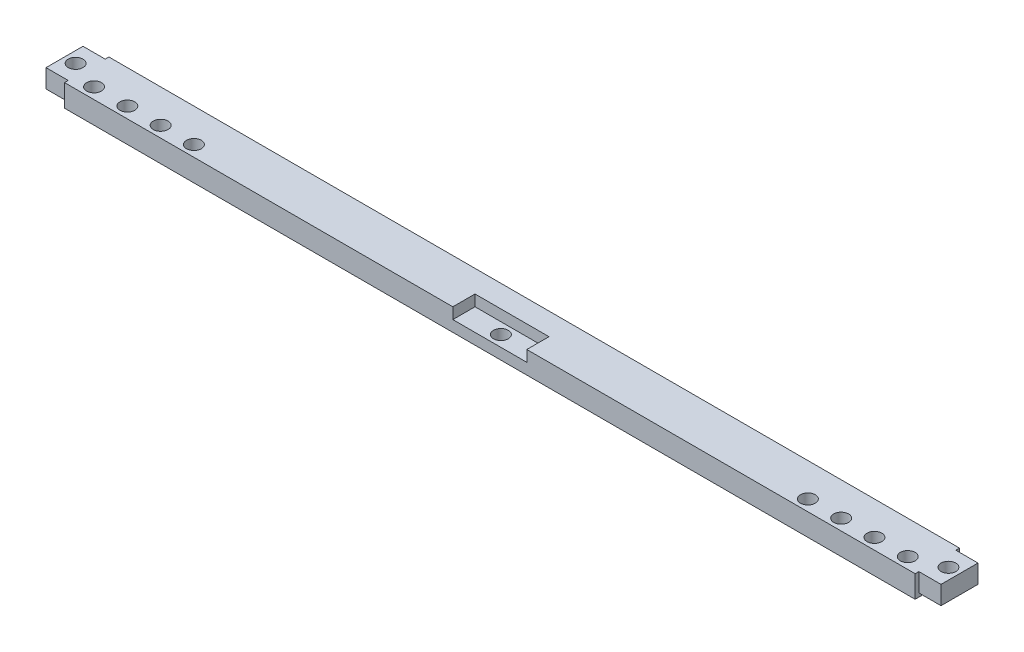
ISO-10303-21;
HEADER;
FILE_DESCRIPTION(('STEP AP214'),'2;1');
FILE_NAME('part.step','',(''),(''),'','','');
FILE_SCHEMA(('AUTOMOTIVE_DESIGN { 1 0 10303 214 1 1 1 1 }'));
ENDSEC;
DATA;
#1=APPLICATION_CONTEXT('core data for automotive mechanical design processes');
#2=APPLICATION_PROTOCOL_DEFINITION('international standard','automotive_design',2000,#1);
#3=PRODUCT_CONTEXT('',#1,'mechanical');
#4=PRODUCT('Part','Part','',(#3));
#5=PRODUCT_RELATED_PRODUCT_CATEGORY('part','',(#4));
#6=PRODUCT_DEFINITION_FORMATION('','',#4);
#7=PRODUCT_DEFINITION_CONTEXT('part definition',#1,'design');
#8=PRODUCT_DEFINITION('design','',#6,#7);
#9=PRODUCT_DEFINITION_SHAPE('','',#8);
#10=(LENGTH_UNIT() NAMED_UNIT(*) SI_UNIT(.MILLI.,.METRE.));
#11=(NAMED_UNIT(*) PLANE_ANGLE_UNIT() SI_UNIT($,.RADIAN.));
#12=(NAMED_UNIT(*) SI_UNIT($,.STERADIAN.) SOLID_ANGLE_UNIT());
#13=UNCERTAINTY_MEASURE_WITH_UNIT(LENGTH_MEASURE(1.E-05),#10,'distance_accuracy_value','');
#14=(GEOMETRIC_REPRESENTATION_CONTEXT(3) GLOBAL_UNCERTAINTY_ASSIGNED_CONTEXT((#13)) GLOBAL_UNIT_ASSIGNED_CONTEXT((#10,
#11,#12)) REPRESENTATION_CONTEXT('',''));
#15=CARTESIAN_POINT('',(0.,0.,0.));
#16=DIRECTION('',(0.,0.,1.));
#17=DIRECTION('',(1.,0.,0.));
#18=AXIS2_PLACEMENT_3D('',#15,#16,#17);
#19=CARTESIAN_POINT('',(307.34,15.24,15.24));
#20=DIRECTION('',(-1.,0.,0.));
#21=DIRECTION('',(0.,0.,1.));
#22=AXIS2_PLACEMENT_3D('',#19,#20,#21);
#23=PLANE('',#22);
#24=DIRECTION('',(0.,0.,1.));
#25=VECTOR('',#24,1.);
#26=CARTESIAN_POINT('',(307.34,2.54,-12.7));
#27=LINE('',#26,#25);
#28=CARTESIAN_POINT('',(307.34,2.54,-12.7));
#29=VERTEX_POINT('',#28);
#30=CARTESIAN_POINT('',(307.34,2.54,12.7));
#31=VERTEX_POINT('',#30);
#32=EDGE_CURVE('E211',#29,#31,#27,.T.);
#33=ORIENTED_EDGE('',*,*,#32,.F.);
#34=DIRECTION('',(0.,1.,0.));
#35=VECTOR('',#34,1.);
#36=CARTESIAN_POINT('',(307.34,0.,-12.7));
#37=LINE('',#36,#35);
#38=CARTESIAN_POINT('',(307.34,15.24,-12.7));
#39=VERTEX_POINT('',#38);
#40=EDGE_CURVE('E228',#29,#39,#37,.T.);
#41=ORIENTED_EDGE('',*,*,#40,.T.);
#42=DIRECTION('',(0.,0.,-1.));
#43=VECTOR('',#42,1.);
#44=CARTESIAN_POINT('',(307.34,15.24,15.24));
#45=LINE('',#44,#43);
#46=CARTESIAN_POINT('',(307.34,15.24,12.7));
#47=VERTEX_POINT('',#46);
#48=EDGE_CURVE('E111',#47,#39,#45,.T.);
#49=ORIENTED_EDGE('',*,*,#48,.F.);
#50=DIRECTION('',(0.,1.,0.));
#51=VECTOR('',#50,1.);
#52=CARTESIAN_POINT('',(307.34,0.,12.7));
#53=LINE('',#52,#51);
#54=EDGE_CURVE('E262',#31,#47,#53,.T.);
#55=ORIENTED_EDGE('',*,*,#54,.F.);
#56=EDGE_LOOP('',(#33,#41,#49,#55));
#57=FACE_BOUND('',#56,.T.);
#58=ADVANCED_FACE('F33',(#57),#23,.F.);
#59=CARTESIAN_POINT('',(307.34,0.,12.7));
#60=DIRECTION('',(0.,0.,-1.));
#61=DIRECTION('',(-1.,0.,0.));
#62=AXIS2_PLACEMENT_3D('',#59,#60,#61);
#63=PLANE('',#62);
#64=DIRECTION('',(-1.,0.,0.));
#65=VECTOR('',#64,1.);
#66=CARTESIAN_POINT('',(307.34,2.54,12.7));
#67=LINE('',#66,#65);
#68=CARTESIAN_POINT('',(292.1,2.54,12.7));
#69=VERTEX_POINT('',#68);
#70=EDGE_CURVE('E214',#31,#69,#67,.T.);
#71=ORIENTED_EDGE('',*,*,#70,.F.);
#72=ORIENTED_EDGE('',*,*,#54,.T.);
#73=DIRECTION('',(-1.,0.,0.));
#74=VECTOR('',#73,1.);
#75=CARTESIAN_POINT('',(307.34,15.24,12.7));
#76=LINE('',#75,#74);
#77=CARTESIAN_POINT('',(292.1,15.24,12.7));
#78=VERTEX_POINT('',#77);
#79=EDGE_CURVE('E223',#47,#78,#76,.T.);
#80=ORIENTED_EDGE('',*,*,#79,.T.);
#81=DIRECTION('',(0.,1.,0.));
#82=VECTOR('',#81,1.);
#83=CARTESIAN_POINT('',(292.1,0.,12.7));
#84=LINE('',#83,#82);
#85=EDGE_CURVE('E265',#69,#78,#84,.T.);
#86=ORIENTED_EDGE('',*,*,#85,.F.);
#87=EDGE_LOOP('',(#71,#72,#80,#86));
#88=FACE_BOUND('',#87,.T.);
#89=ADVANCED_FACE('F274',(#88),#63,.F.);
#90=CARTESIAN_POINT('',(307.34,0.,-12.7));
#91=DIRECTION('',(0.,0.,1.));
#92=DIRECTION('',(1.,0.,0.));
#93=AXIS2_PLACEMENT_3D('',#90,#91,#92);
#94=PLANE('',#93);
#95=DIRECTION('',(1.,0.,0.));
#96=VECTOR('',#95,1.);
#97=CARTESIAN_POINT('',(307.34,2.54,-12.7));
#98=LINE('',#97,#96);
#99=CARTESIAN_POINT('',(292.1,2.54,-12.7));
#100=VERTEX_POINT('',#99);
#101=EDGE_CURVE('E220',#100,#29,#98,.T.);
#102=ORIENTED_EDGE('',*,*,#101,.F.);
#103=DIRECTION('',(0.,1.,0.));
#104=VECTOR('',#103,1.);
#105=CARTESIAN_POINT('',(292.1,0.,-12.7));
#106=LINE('',#105,#104);
#107=CARTESIAN_POINT('',(292.1,15.24,-12.7));
#108=VERTEX_POINT('',#107);
#109=EDGE_CURVE('E252',#100,#108,#106,.T.);
#110=ORIENTED_EDGE('',*,*,#109,.T.);
#111=DIRECTION('',(1.,0.,0.));
#112=VECTOR('',#111,1.);
#113=CARTESIAN_POINT('',(307.34,15.24,-12.7));
#114=LINE('',#113,#112);
#115=EDGE_CURVE('E243',#108,#39,#114,.T.);
#116=ORIENTED_EDGE('',*,*,#115,.T.);
#117=ORIENTED_EDGE('',*,*,#40,.F.);
#118=EDGE_LOOP('',(#102,#110,#116,#117));
#119=FACE_BOUND('',#118,.T.);
#120=ADVANCED_FACE('F293',(#119),#94,.F.);
#121=CARTESIAN_POINT('',(-307.34,15.24,-15.24));
#122=DIRECTION('',(0.,0.,1.));
#123=DIRECTION('',(1.,0.,0.));
#124=AXIS2_PLACEMENT_3D('',#121,#122,#123);
#125=PLANE('',#124);
#126=DIRECTION('',(-1.,0.,0.));
#127=VECTOR('',#126,1.);
#128=CARTESIAN_POINT('',(-307.34,15.24,-15.24));
#129=LINE('',#128,#127);
#130=CARTESIAN_POINT('',(292.1,15.24,-15.24));
#131=VERTEX_POINT('',#130);
#132=CARTESIAN_POINT('',(-292.1,15.24,-15.24));
#133=VERTEX_POINT('',#132);
#134=EDGE_CURVE('E103',#131,#133,#129,.T.);
#135=ORIENTED_EDGE('',*,*,#134,.F.);
#136=DIRECTION('',(0.,1.,0.));
#137=VECTOR('',#136,1.);
#138=CARTESIAN_POINT('',(292.1,0.,-15.24));
#139=LINE('',#138,#137);
#140=CARTESIAN_POINT('',(292.1,0.,-15.24));
#141=VERTEX_POINT('',#140);
#142=EDGE_CURVE('E242',#141,#131,#139,.T.);
#143=ORIENTED_EDGE('',*,*,#142,.F.);
#144=DIRECTION('',(-1.,0.,0.));
#145=VECTOR('',#144,1.);
#146=CARTESIAN_POINT('',(-307.34,0.,-15.24));
#147=LINE('',#146,#145);
#148=CARTESIAN_POINT('',(-292.1,0.,-15.24));
#149=VERTEX_POINT('',#148);
#150=EDGE_CURVE('E58',#141,#149,#147,.T.);
#151=ORIENTED_EDGE('',*,*,#150,.T.);
#152=DIRECTION('',(0.,1.,0.));
#153=VECTOR('',#152,1.);
#154=CARTESIAN_POINT('',(-292.1,0.,-15.24));
#155=LINE('',#154,#153);
#156=EDGE_CURVE('E87',#149,#133,#155,.T.);
#157=ORIENTED_EDGE('',*,*,#156,.T.);
#158=EDGE_LOOP('',(#135,#143,#151,#157));
#159=FACE_BOUND('',#158,.T.);
#160=ADVANCED_FACE('F326',(#159),#125,.F.);
#161=CARTESIAN_POINT('',(-307.34,15.24,15.24));
#162=DIRECTION('',(1.,0.,0.));
#163=DIRECTION('',(0.,0.,-1.));
#164=AXIS2_PLACEMENT_3D('',#161,#162,#163);
#165=PLANE('',#164);
#166=DIRECTION('',(0.,1.,0.));
#167=VECTOR('',#166,1.);
#168=CARTESIAN_POINT('',(-307.34,0.,-12.7));
#169=LINE('',#168,#167);
#170=CARTESIAN_POINT('',(-307.34,2.54,-12.7));
#171=VERTEX_POINT('',#170);
#172=CARTESIAN_POINT('',(-307.34,15.24,-12.7));
#173=VERTEX_POINT('',#172);
#174=EDGE_CURVE('E88',#171,#173,#169,.T.);
#175=ORIENTED_EDGE('',*,*,#174,.F.);
#176=DIRECTION('',(0.,0.,-1.));
#177=VECTOR('',#176,1.);
#178=CARTESIAN_POINT('',(-307.34,2.54,-12.7));
#179=LINE('',#178,#177);
#180=CARTESIAN_POINT('',(-307.34,2.54,12.7));
#181=VERTEX_POINT('',#180);
#182=EDGE_CURVE('E124',#181,#171,#179,.T.);
#183=ORIENTED_EDGE('',*,*,#182,.F.);
#184=DIRECTION('',(0.,1.,0.));
#185=VECTOR('',#184,1.);
#186=CARTESIAN_POINT('',(-307.34,0.,12.7));
#187=LINE('',#186,#185);
#188=CARTESIAN_POINT('',(-307.34,15.24,12.7));
#189=VERTEX_POINT('',#188);
#190=EDGE_CURVE('E97',#181,#189,#187,.T.);
#191=ORIENTED_EDGE('',*,*,#190,.T.);
#192=DIRECTION('',(0.,0.,1.));
#193=VECTOR('',#192,1.);
#194=CARTESIAN_POINT('',(-307.34,15.24,15.24));
#195=LINE('',#194,#193);
#196=EDGE_CURVE('E116',#173,#189,#195,.T.);
#197=ORIENTED_EDGE('',*,*,#196,.F.);
#198=EDGE_LOOP('',(#175,#183,#191,#197));
#199=FACE_BOUND('',#198,.T.);
#200=ADVANCED_FACE('F328',(#199),#165,.F.);
#201=CARTESIAN_POINT('',(-307.34,15.24,15.24));
#202=DIRECTION('',(0.,0.,-1.));
#203=DIRECTION('',(-1.,0.,0.));
#204=AXIS2_PLACEMENT_3D('',#201,#202,#203);
#205=PLANE('',#204);
#206=DIRECTION('',(1.,0.,0.));
#207=VECTOR('',#206,1.);
#208=CARTESIAN_POINT('',(-307.34,15.24,15.24));
#209=LINE('',#208,#207);
#210=CARTESIAN_POINT('',(25.4,15.24,15.24));
#211=VERTEX_POINT('',#210);
#212=CARTESIAN_POINT('',(292.1,15.24,15.24));
#213=VERTEX_POINT('',#212);
#214=EDGE_CURVE('E41',#211,#213,#209,.T.);
#215=ORIENTED_EDGE('',*,*,#214,.F.);
#216=DIRECTION('',(0.,1.,0.));
#217=VECTOR('',#216,1.);
#218=CARTESIAN_POINT('',(25.4,7.62,15.24));
#219=LINE('',#218,#217);
#220=CARTESIAN_POINT('',(25.4,7.62,15.24));
#221=VERTEX_POINT('',#220);
#222=EDGE_CURVE('E190',#221,#211,#219,.T.);
#223=ORIENTED_EDGE('',*,*,#222,.F.);
#224=DIRECTION('',(1.,0.,0.));
#225=VECTOR('',#224,1.);
#226=CARTESIAN_POINT('',(-25.4,7.62,15.24));
#227=LINE('',#226,#225);
#228=CARTESIAN_POINT('',(-25.4,7.62,15.24));
#229=VERTEX_POINT('',#228);
#230=EDGE_CURVE('E180',#229,#221,#227,.T.);
#231=ORIENTED_EDGE('',*,*,#230,.F.);
#232=DIRECTION('',(0.,1.,0.));
#233=VECTOR('',#232,1.);
#234=CARTESIAN_POINT('',(-25.4,7.62,15.24));
#235=LINE('',#234,#233);
#236=CARTESIAN_POINT('',(-25.4,15.24,15.24));
#237=VERTEX_POINT('',#236);
#238=EDGE_CURVE('E192',#229,#237,#235,.T.);
#239=ORIENTED_EDGE('',*,*,#238,.T.);
#240=CARTESIAN_POINT('',(-292.1,15.24,15.24));
#241=VERTEX_POINT('',#240);
#242=EDGE_CURVE('E11',#241,#237,#209,.T.);
#243=ORIENTED_EDGE('',*,*,#242,.F.);
#244=DIRECTION('',(0.,1.,0.));
#245=VECTOR('',#244,1.);
#246=CARTESIAN_POINT('',(-292.1,0.,15.24));
#247=LINE('',#246,#245);
#248=CARTESIAN_POINT('',(-292.1,0.,15.24));
#249=VERTEX_POINT('',#248);
#250=EDGE_CURVE('E231',#249,#241,#247,.T.);
#251=ORIENTED_EDGE('',*,*,#250,.F.);
#252=DIRECTION('',(1.,0.,0.));
#253=VECTOR('',#252,1.);
#254=CARTESIAN_POINT('',(-307.34,0.,15.24));
#255=LINE('',#254,#253);
#256=CARTESIAN_POINT('',(292.1,0.,15.24));
#257=VERTEX_POINT('',#256);
#258=EDGE_CURVE('E114',#249,#257,#255,.T.);
#259=ORIENTED_EDGE('',*,*,#258,.T.);
#260=DIRECTION('',(0.,1.,0.));
#261=VECTOR('',#260,1.);
#262=CARTESIAN_POINT('',(292.1,0.,15.24));
#263=LINE('',#262,#261);
#264=EDGE_CURVE('E247',#257,#213,#263,.T.);
#265=ORIENTED_EDGE('',*,*,#264,.T.);
#266=EDGE_LOOP('',(#215,#223,#231,#239,#243,#251,#259,#265));
#267=FACE_BOUND('',#266,.T.);
#268=ADVANCED_FACE('F310',(#267),#205,.F.);
#269=CARTESIAN_POINT('',(0.,15.24,0.));
#270=DIRECTION('',(0.,-1.,0.));
#271=DIRECTION('',(0.,0.,-1.));
#272=AXIS2_PLACEMENT_3D('',#269,#270,#271);
#273=PLANE('',#272);
#274=CARTESIAN_POINT('',(-256.54,15.24,7.62));
#275=DIRECTION('',(0.,1.,0.));
#276=DIRECTION('',(0.,0.,1.));
#277=AXIS2_PLACEMENT_3D('',#274,#275,#276);
#278=CIRCLE('',#277,5.07999999999996);
#279=CARTESIAN_POINT('',(-256.54,15.24,12.7));
#280=VERTEX_POINT('',#279);
#281=EDGE_CURVE('E139',#280,#280,#278,.T.);
#282=ORIENTED_EDGE('',*,*,#281,.F.);
#283=EDGE_LOOP('',(#282));
#284=FACE_BOUND('',#283,.T.);
#285=CARTESIAN_POINT('',(-233.68,15.24,7.62));
#286=DIRECTION('',(0.,1.,0.));
#287=DIRECTION('',(0.,0.,1.));
#288=AXIS2_PLACEMENT_3D('',#285,#286,#287);
#289=CIRCLE('',#288,5.07999999999999);
#290=CARTESIAN_POINT('',(-233.68,15.24,12.7));
#291=VERTEX_POINT('',#290);
#292=EDGE_CURVE('E609',#291,#291,#289,.T.);
#293=ORIENTED_EDGE('',*,*,#292,.F.);
#294=EDGE_LOOP('',(#293));
#295=FACE_BOUND('',#294,.T.);
#296=CARTESIAN_POINT('',(-210.82,15.24,7.62));
#297=DIRECTION('',(0.,1.,0.));
#298=DIRECTION('',(0.,0.,1.));
#299=AXIS2_PLACEMENT_3D('',#296,#297,#298);
#300=CIRCLE('',#299,5.07999999999999);
#301=CARTESIAN_POINT('',(-210.82,15.24,12.7));
#302=VERTEX_POINT('',#301);
#303=EDGE_CURVE('E612',#302,#302,#300,.T.);
#304=ORIENTED_EDGE('',*,*,#303,.F.);
#305=EDGE_LOOP('',(#304));
#306=FACE_BOUND('',#305,.T.);
#307=CARTESIAN_POINT('',(233.68,15.24,7.62));
#308=DIRECTION('',(0.,1.,0.));
#309=DIRECTION('',(0.,0.,1.));
#310=AXIS2_PLACEMENT_3D('',#307,#308,#309);
#311=CIRCLE('',#310,5.07999999999999);
#312=CARTESIAN_POINT('',(233.68,15.24,12.7));
#313=VERTEX_POINT('',#312);
#314=EDGE_CURVE('E621',#313,#313,#311,.T.);
#315=ORIENTED_EDGE('',*,*,#314,.F.);
#316=EDGE_LOOP('',(#315));
#317=FACE_BOUND('',#316,.T.);
#318=CARTESIAN_POINT('',(256.54,15.24,7.62));
#319=DIRECTION('',(0.,1.,0.));
#320=DIRECTION('',(0.,0.,1.));
#321=AXIS2_PLACEMENT_3D('',#318,#319,#320);
#322=CIRCLE('',#321,5.07999999999996);
#323=CARTESIAN_POINT('',(256.54,15.24,12.7));
#324=VERTEX_POINT('',#323);
#325=EDGE_CURVE('E618',#324,#324,#322,.T.);
#326=ORIENTED_EDGE('',*,*,#325,.F.);
#327=EDGE_LOOP('',(#326));
#328=FACE_BOUND('',#327,.T.);
#329=CARTESIAN_POINT('',(210.82,15.24,7.62));
#330=DIRECTION('',(0.,1.,0.));
#331=DIRECTION('',(0.,0.,1.));
#332=AXIS2_PLACEMENT_3D('',#329,#330,#331);
#333=CIRCLE('',#332,5.07999999999999);
#334=CARTESIAN_POINT('',(210.82,15.24,12.7));
#335=VERTEX_POINT('',#334);
#336=EDGE_CURVE('E163',#335,#335,#333,.T.);
#337=ORIENTED_EDGE('',*,*,#336,.F.);
#338=EDGE_LOOP('',(#337));
#339=FACE_BOUND('',#338,.T.);
#340=CARTESIAN_POINT('',(279.4,15.24,7.62));
#341=DIRECTION('',(0.,1.,0.));
#342=DIRECTION('',(0.,0.,1.));
#343=AXIS2_PLACEMENT_3D('',#340,#341,#342);
#344=CIRCLE('',#343,5.07999999999996);
#345=CARTESIAN_POINT('',(279.4,15.24,12.7));
#346=VERTEX_POINT('',#345);
#347=EDGE_CURVE('E617',#346,#346,#344,.T.);
#348=ORIENTED_EDGE('',*,*,#347,.F.);
#349=EDGE_LOOP('',(#348));
#350=FACE_BOUND('',#349,.T.);
#351=CARTESIAN_POINT('',(-279.4,15.24,7.62));
#352=DIRECTION('',(0.,1.,0.));
#353=DIRECTION('',(0.,0.,1.));
#354=AXIS2_PLACEMENT_3D('',#351,#352,#353);
#355=CIRCLE('',#354,5.07999999999996);
#356=CARTESIAN_POINT('',(-279.4,15.24,12.7));
#357=VERTEX_POINT('',#356);
#358=EDGE_CURVE('E134',#357,#357,#355,.T.);
#359=ORIENTED_EDGE('',*,*,#358,.F.);
#360=EDGE_LOOP('',(#359));
#361=FACE_BOUND('',#360,.T.);
#362=CARTESIAN_POINT('',(299.72,15.24,0.));
#363=DIRECTION('',(0.,1.,0.));
#364=DIRECTION('',(0.,0.,1.));
#365=AXIS2_PLACEMENT_3D('',#362,#363,#364);
#366=CIRCLE('',#365,5.07999999999996);
#367=CARTESIAN_POINT('',(299.72,15.24,5.07999999999996));
#368=VERTEX_POINT('',#367);
#369=EDGE_CURVE('E129',#368,#368,#366,.T.);
#370=ORIENTED_EDGE('',*,*,#369,.F.);
#371=EDGE_LOOP('',(#370));
#372=FACE_BOUND('',#371,.T.);
#373=CARTESIAN_POINT('',(-299.72,15.24,0.));
#374=DIRECTION('',(0.,1.,0.));
#375=DIRECTION('',(0.,0.,1.));
#376=AXIS2_PLACEMENT_3D('',#373,#374,#375);
#377=CIRCLE('',#376,5.07999999999996);
#378=CARTESIAN_POINT('',(-299.72,15.24,5.07999999999996));
#379=VERTEX_POINT('',#378);
#380=EDGE_CURVE('E125',#379,#379,#377,.T.);
#381=ORIENTED_EDGE('',*,*,#380,.F.);
#382=EDGE_LOOP('',(#381));
#383=FACE_BOUND('',#382,.T.);
#384=DIRECTION('',(-1.,0.,0.));
#385=VECTOR('',#384,1.);
#386=CARTESIAN_POINT('',(-25.4,15.24,0.));
#387=LINE('',#386,#385);
#388=CARTESIAN_POINT('',(25.4,15.24,0.));
#389=VERTEX_POINT('',#388);
#390=CARTESIAN_POINT('',(-25.4,15.24,0.));
#391=VERTEX_POINT('',#390);
#392=EDGE_CURVE('E185',#389,#391,#387,.T.);
#393=ORIENTED_EDGE('',*,*,#392,.F.);
#394=DIRECTION('',(0.,0.,-1.));
#395=VECTOR('',#394,1.);
#396=CARTESIAN_POINT('',(25.4,15.24,15.24));
#397=LINE('',#396,#395);
#398=EDGE_CURVE('E49',#211,#389,#397,.T.);
#399=ORIENTED_EDGE('',*,*,#398,.F.);
#400=ORIENTED_EDGE('',*,*,#214,.T.);
#401=DIRECTION('',(0.,0.,1.));
#402=VECTOR('',#401,1.);
#403=CARTESIAN_POINT('',(292.1,15.24,15.24));
#404=LINE('',#403,#402);
#405=EDGE_CURVE('E259',#78,#213,#404,.T.);
#406=ORIENTED_EDGE('',*,*,#405,.F.);
#407=ORIENTED_EDGE('',*,*,#79,.F.);
#408=ORIENTED_EDGE('',*,*,#48,.T.);
#409=ORIENTED_EDGE('',*,*,#115,.F.);
#410=DIRECTION('',(0.,0.,1.));
#411=VECTOR('',#410,1.);
#412=CARTESIAN_POINT('',(292.1,15.24,-15.24));
#413=LINE('',#412,#411);
#414=EDGE_CURVE('E244',#131,#108,#413,.T.);
#415=ORIENTED_EDGE('',*,*,#414,.F.);
#416=ORIENTED_EDGE('',*,*,#134,.T.);
#417=DIRECTION('',(0.,0.,-1.));
#418=VECTOR('',#417,1.);
#419=CARTESIAN_POINT('',(-292.1,15.24,-15.24));
#420=LINE('',#419,#418);
#421=CARTESIAN_POINT('',(-292.1,15.24,-12.7));
#422=VERTEX_POINT('',#421);
#423=EDGE_CURVE('E79',#422,#133,#420,.T.);
#424=ORIENTED_EDGE('',*,*,#423,.F.);
#425=DIRECTION('',(1.,0.,0.));
#426=VECTOR('',#425,1.);
#427=CARTESIAN_POINT('',(-307.34,15.24,-12.7));
#428=LINE('',#427,#426);
#429=EDGE_CURVE('E91',#173,#422,#428,.T.);
#430=ORIENTED_EDGE('',*,*,#429,.F.);
#431=ORIENTED_EDGE('',*,*,#196,.T.);
#432=DIRECTION('',(-1.,0.,0.));
#433=VECTOR('',#432,1.);
#434=CARTESIAN_POINT('',(-307.34,15.24,12.7));
#435=LINE('',#434,#433);
#436=CARTESIAN_POINT('',(-292.1,15.24,12.7));
#437=VERTEX_POINT('',#436);
#438=EDGE_CURVE('E227',#437,#189,#435,.T.);
#439=ORIENTED_EDGE('',*,*,#438,.F.);
#440=DIRECTION('',(0.,0.,-1.));
#441=VECTOR('',#440,1.);
#442=CARTESIAN_POINT('',(-292.1,15.24,15.24));
#443=LINE('',#442,#441);
#444=EDGE_CURVE('E224',#241,#437,#443,.T.);
#445=ORIENTED_EDGE('',*,*,#444,.F.);
#446=ORIENTED_EDGE('',*,*,#242,.T.);
#447=DIRECTION('',(0.,0.,1.));
#448=VECTOR('',#447,1.);
#449=CARTESIAN_POINT('',(-25.4,15.24,15.24));
#450=LINE('',#449,#448);
#451=EDGE_CURVE('E174',#391,#237,#450,.T.);
#452=ORIENTED_EDGE('',*,*,#451,.F.);
#453=EDGE_LOOP('',(#393,#399,#400,#406,#407,#408,#409,#415,#416,#424,#430,#431,#439,#445,#446,#452));
#454=FACE_BOUND('',#453,.T.);
#455=ADVANCED_FACE('F100',(#284,#295,#306,#317,#328,#339,#350,#361,#372,#383,#454),#273,.F.);
#456=CARTESIAN_POINT('',(0.,0.,0.));
#457=DIRECTION('',(0.,-1.,0.));
#458=DIRECTION('',(0.,0.,-1.));
#459=AXIS2_PLACEMENT_3D('',#456,#457,#458);
#460=PLANE('',#459);
#461=CARTESIAN_POINT('',(-256.54,0.,7.62));
#462=DIRECTION('',(0.,-1.,0.));
#463=DIRECTION('',(0.,0.,-1.));
#464=AXIS2_PLACEMENT_3D('',#461,#462,#463);
#465=CIRCLE('',#464,5.07999999999996);
#466=CARTESIAN_POINT('',(-256.54,0.,2.54000000000004));
#467=VERTEX_POINT('',#466);
#468=EDGE_CURVE('E36',#467,#467,#465,.T.);
#469=ORIENTED_EDGE('',*,*,#468,.F.);
#470=EDGE_LOOP('',(#469));
#471=FACE_BOUND('',#470,.T.);
#472=CARTESIAN_POINT('',(-233.68,0.,7.62));
#473=DIRECTION('',(0.,-1.,0.));
#474=DIRECTION('',(0.,0.,-1.));
#475=AXIS2_PLACEMENT_3D('',#472,#473,#474);
#476=CIRCLE('',#475,5.07999999999999);
#477=CARTESIAN_POINT('',(-233.68,0.,2.54000000000001));
#478=VERTEX_POINT('',#477);
#479=EDGE_CURVE('E150',#478,#478,#476,.T.);
#480=ORIENTED_EDGE('',*,*,#479,.F.);
#481=EDGE_LOOP('',(#480));
#482=FACE_BOUND('',#481,.T.);
#483=CARTESIAN_POINT('',(-210.82,0.,7.62));
#484=DIRECTION('',(0.,-1.,0.));
#485=DIRECTION('',(0.,0.,-1.));
#486=AXIS2_PLACEMENT_3D('',#483,#484,#485);
#487=CIRCLE('',#486,5.07999999999999);
#488=CARTESIAN_POINT('',(-210.82,0.,2.54000000000001));
#489=VERTEX_POINT('',#488);
#490=EDGE_CURVE('E148',#489,#489,#487,.T.);
#491=ORIENTED_EDGE('',*,*,#490,.F.);
#492=EDGE_LOOP('',(#491));
#493=FACE_BOUND('',#492,.T.);
#494=CARTESIAN_POINT('',(233.68,0.,7.62));
#495=DIRECTION('',(0.,-1.,0.));
#496=DIRECTION('',(0.,0.,-1.));
#497=AXIS2_PLACEMENT_3D('',#494,#495,#496);
#498=CIRCLE('',#497,5.07999999999999);
#499=CARTESIAN_POINT('',(233.68,0.,2.54000000000001));
#500=VERTEX_POINT('',#499);
#501=EDGE_CURVE('E145',#500,#500,#498,.T.);
#502=ORIENTED_EDGE('',*,*,#501,.F.);
#503=EDGE_LOOP('',(#502));
#504=FACE_BOUND('',#503,.T.);
#505=CARTESIAN_POINT('',(256.54,0.,7.62));
#506=DIRECTION('',(0.,-1.,0.));
#507=DIRECTION('',(0.,0.,-1.));
#508=AXIS2_PLACEMENT_3D('',#505,#506,#507);
#509=CIRCLE('',#508,5.07999999999996);
#510=CARTESIAN_POINT('',(256.54,0.,2.54000000000004));
#511=VERTEX_POINT('',#510);
#512=EDGE_CURVE('E142',#511,#511,#509,.T.);
#513=ORIENTED_EDGE('',*,*,#512,.F.);
#514=EDGE_LOOP('',(#513));
#515=FACE_BOUND('',#514,.T.);
#516=CARTESIAN_POINT('',(210.82,0.,7.62));
#517=DIRECTION('',(0.,-1.,0.));
#518=DIRECTION('',(0.,0.,-1.));
#519=AXIS2_PLACEMENT_3D('',#516,#517,#518);
#520=CIRCLE('',#519,5.07999999999999);
#521=CARTESIAN_POINT('',(210.82,0.,2.54000000000001));
#522=VERTEX_POINT('',#521);
#523=EDGE_CURVE('E138',#522,#522,#520,.T.);
#524=ORIENTED_EDGE('',*,*,#523,.F.);
#525=EDGE_LOOP('',(#524));
#526=FACE_BOUND('',#525,.T.);
#527=CARTESIAN_POINT('',(279.4,0.,7.62));
#528=DIRECTION('',(0.,-1.,0.));
#529=DIRECTION('',(0.,0.,-1.));
#530=AXIS2_PLACEMENT_3D('',#527,#528,#529);
#531=CIRCLE('',#530,5.07999999999996);
#532=CARTESIAN_POINT('',(279.4,0.,2.54000000000004));
#533=VERTEX_POINT('',#532);
#534=EDGE_CURVE('E135',#533,#533,#531,.T.);
#535=ORIENTED_EDGE('',*,*,#534,.F.);
#536=EDGE_LOOP('',(#535));
#537=FACE_BOUND('',#536,.T.);
#538=CARTESIAN_POINT('',(-279.4,0.,7.62));
#539=DIRECTION('',(0.,-1.,0.));
#540=DIRECTION('',(0.,0.,-1.));
#541=AXIS2_PLACEMENT_3D('',#538,#539,#540);
#542=CIRCLE('',#541,5.07999999999996);
#543=CARTESIAN_POINT('',(-279.4,0.,2.54000000000004));
#544=VERTEX_POINT('',#543);
#545=EDGE_CURVE('E130',#544,#544,#542,.T.);
#546=ORIENTED_EDGE('',*,*,#545,.F.);
#547=EDGE_LOOP('',(#546));
#548=FACE_BOUND('',#547,.T.);
#549=CARTESIAN_POINT('',(0.,0.,7.62));
#550=DIRECTION('',(0.,-1.,0.));
#551=DIRECTION('',(0.,0.,-1.));
#552=AXIS2_PLACEMENT_3D('',#549,#550,#551);
#553=CIRCLE('',#552,5.08);
#554=CARTESIAN_POINT('',(0.,0.,2.54));
#555=VERTEX_POINT('',#554);
#556=EDGE_CURVE('E167',#555,#555,#553,.T.);
#557=ORIENTED_EDGE('',*,*,#556,.F.);
#558=EDGE_LOOP('',(#557));
#559=FACE_BOUND('',#558,.T.);
#560=ORIENTED_EDGE('',*,*,#258,.F.);
#561=DIRECTION('',(0.,0.,-1.));
#562=VECTOR('',#561,1.);
#563=CARTESIAN_POINT('',(-292.1,0.,-15.24));
#564=LINE('',#563,#562);
#565=EDGE_CURVE('E104',#249,#149,#564,.T.);
#566=ORIENTED_EDGE('',*,*,#565,.T.);
#567=ORIENTED_EDGE('',*,*,#150,.F.);
#568=DIRECTION('',(0.,0.,1.));
#569=VECTOR('',#568,1.);
#570=CARTESIAN_POINT('',(292.1,0.,-15.24));
#571=LINE('',#570,#569);
#572=EDGE_CURVE('E239',#141,#257,#571,.T.);
#573=ORIENTED_EDGE('',*,*,#572,.T.);
#574=EDGE_LOOP('',(#560,#566,#567,#573));
#575=FACE_BOUND('',#574,.T.);
#576=ADVANCED_FACE('F315',(#471,#482,#493,#504,#515,#526,#537,#548,#559,#575),#460,.T.);
#577=CARTESIAN_POINT('',(-292.1,0.,-15.24));
#578=DIRECTION('',(1.,0.,0.));
#579=DIRECTION('',(0.,0.,-1.));
#580=AXIS2_PLACEMENT_3D('',#577,#578,#579);
#581=PLANE('',#580);
#582=ORIENTED_EDGE('',*,*,#423,.T.);
#583=ORIENTED_EDGE('',*,*,#156,.F.);
#584=ORIENTED_EDGE('',*,*,#565,.F.);
#585=ORIENTED_EDGE('',*,*,#250,.T.);
#586=ORIENTED_EDGE('',*,*,#444,.T.);
#587=DIRECTION('',(0.,1.,0.));
#588=VECTOR('',#587,1.);
#589=CARTESIAN_POINT('',(-292.1,0.,12.7));
#590=LINE('',#589,#588);
#591=CARTESIAN_POINT('',(-292.1,2.54,12.7));
#592=VERTEX_POINT('',#591);
#593=EDGE_CURVE('E234',#592,#437,#590,.T.);
#594=ORIENTED_EDGE('',*,*,#593,.F.);
#595=DIRECTION('',(0.,0.,1.));
#596=VECTOR('',#595,1.);
#597=CARTESIAN_POINT('',(-292.1,2.54,-12.7));
#598=LINE('',#597,#596);
#599=CARTESIAN_POINT('',(-292.1,2.54,-12.7));
#600=VERTEX_POINT('',#599);
#601=EDGE_CURVE('E83',#600,#592,#598,.T.);
#602=ORIENTED_EDGE('',*,*,#601,.F.);
#603=DIRECTION('',(0.,1.,0.));
#604=VECTOR('',#603,1.);
#605=CARTESIAN_POINT('',(-292.1,0.,-12.7));
#606=LINE('',#605,#604);
#607=EDGE_CURVE('E75',#600,#422,#606,.T.);
#608=ORIENTED_EDGE('',*,*,#607,.T.);
#609=EDGE_LOOP('',(#582,#583,#584,#585,#586,#594,#602,#608));
#610=FACE_BOUND('',#609,.T.);
#611=ADVANCED_FACE('F77',(#610),#581,.F.);
#612=CARTESIAN_POINT('',(-307.34,0.,-12.7));
#613=DIRECTION('',(0.,0.,1.));
#614=DIRECTION('',(1.,0.,0.));
#615=AXIS2_PLACEMENT_3D('',#612,#613,#614);
#616=PLANE('',#615);
#617=ORIENTED_EDGE('',*,*,#607,.F.);
#618=DIRECTION('',(1.,0.,0.));
#619=VECTOR('',#618,1.);
#620=CARTESIAN_POINT('',(-307.34,2.54,-12.7));
#621=LINE('',#620,#619);
#622=EDGE_CURVE('E205',#171,#600,#621,.T.);
#623=ORIENTED_EDGE('',*,*,#622,.F.);
#624=ORIENTED_EDGE('',*,*,#174,.T.);
#625=ORIENTED_EDGE('',*,*,#429,.T.);
#626=EDGE_LOOP('',(#617,#623,#624,#625));
#627=FACE_BOUND('',#626,.T.);
#628=ADVANCED_FACE('F92',(#627),#616,.F.);
#629=CARTESIAN_POINT('',(292.1,0.,-15.24));
#630=DIRECTION('',(-1.,0.,0.));
#631=DIRECTION('',(0.,0.,1.));
#632=AXIS2_PLACEMENT_3D('',#629,#630,#631);
#633=PLANE('',#632);
#634=ORIENTED_EDGE('',*,*,#414,.T.);
#635=ORIENTED_EDGE('',*,*,#109,.F.);
#636=DIRECTION('',(0.,0.,-1.));
#637=VECTOR('',#636,1.);
#638=CARTESIAN_POINT('',(292.1,2.54,-12.7));
#639=LINE('',#638,#637);
#640=EDGE_CURVE('E217',#69,#100,#639,.T.);
#641=ORIENTED_EDGE('',*,*,#640,.F.);
#642=ORIENTED_EDGE('',*,*,#85,.T.);
#643=ORIENTED_EDGE('',*,*,#405,.T.);
#644=ORIENTED_EDGE('',*,*,#264,.F.);
#645=ORIENTED_EDGE('',*,*,#572,.F.);
#646=ORIENTED_EDGE('',*,*,#142,.T.);
#647=EDGE_LOOP('',(#634,#635,#641,#642,#643,#644,#645,#646));
#648=FACE_BOUND('',#647,.T.);
#649=ADVANCED_FACE('F308',(#648),#633,.F.);
#650=CARTESIAN_POINT('',(-307.34,0.,12.7));
#651=DIRECTION('',(0.,0.,-1.));
#652=DIRECTION('',(-1.,0.,0.));
#653=AXIS2_PLACEMENT_3D('',#650,#651,#652);
#654=PLANE('',#653);
#655=ORIENTED_EDGE('',*,*,#190,.F.);
#656=DIRECTION('',(-1.,0.,0.));
#657=VECTOR('',#656,1.);
#658=CARTESIAN_POINT('',(-307.34,2.54,12.7));
#659=LINE('',#658,#657);
#660=EDGE_CURVE('E208',#592,#181,#659,.T.);
#661=ORIENTED_EDGE('',*,*,#660,.F.);
#662=ORIENTED_EDGE('',*,*,#593,.T.);
#663=ORIENTED_EDGE('',*,*,#438,.T.);
#664=EDGE_LOOP('',(#655,#661,#662,#663));
#665=FACE_BOUND('',#664,.T.);
#666=ADVANCED_FACE('F391',(#665),#654,.F.);
#667=CARTESIAN_POINT('',(0.,2.54,0.));
#668=DIRECTION('',(0.,-1.,0.));
#669=DIRECTION('',(0.,0.,-1.));
#670=AXIS2_PLACEMENT_3D('',#667,#668,#669);
#671=PLANE('',#670);
#672=CARTESIAN_POINT('',(299.72,2.54,0.));
#673=DIRECTION('',(0.,-1.,0.));
#674=DIRECTION('',(0.,0.,-1.));
#675=AXIS2_PLACEMENT_3D('',#672,#673,#674);
#676=CIRCLE('',#675,5.07999999999996);
#677=CARTESIAN_POINT('',(299.72,2.54,5.07999999999996));
#678=VERTEX_POINT('',#677);
#679=EDGE_CURVE('E126',#678,#678,#676,.T.);
#680=ORIENTED_EDGE('',*,*,#679,.F.);
#681=EDGE_LOOP('',(#680));
#682=FACE_BOUND('',#681,.T.);
#683=ORIENTED_EDGE('',*,*,#32,.T.);
#684=ORIENTED_EDGE('',*,*,#70,.T.);
#685=ORIENTED_EDGE('',*,*,#640,.T.);
#686=ORIENTED_EDGE('',*,*,#101,.T.);
#687=EDGE_LOOP('',(#683,#684,#685,#686));
#688=FACE_BOUND('',#687,.T.);
#689=ADVANCED_FACE('F397',(#682,#688),#671,.T.);
#690=CARTESIAN_POINT('',(0.,2.54,0.));
#691=DIRECTION('',(0.,1.,0.));
#692=DIRECTION('',(0.,0.,1.));
#693=AXIS2_PLACEMENT_3D('',#690,#691,#692);
#694=PLANE('',#693);
#695=CARTESIAN_POINT('',(-299.72,2.54,0.));
#696=DIRECTION('',(0.,1.,0.));
#697=DIRECTION('',(0.,0.,1.));
#698=AXIS2_PLACEMENT_3D('',#695,#696,#697);
#699=CIRCLE('',#698,5.07999999999996);
#700=CARTESIAN_POINT('',(-299.72,2.54,5.07999999999996));
#701=VERTEX_POINT('',#700);
#702=EDGE_CURVE('E121',#701,#701,#699,.T.);
#703=ORIENTED_EDGE('',*,*,#702,.T.);
#704=EDGE_LOOP('',(#703));
#705=FACE_BOUND('',#704,.T.);
#706=ORIENTED_EDGE('',*,*,#182,.T.);
#707=ORIENTED_EDGE('',*,*,#622,.T.);
#708=ORIENTED_EDGE('',*,*,#601,.T.);
#709=ORIENTED_EDGE('',*,*,#660,.T.);
#710=EDGE_LOOP('',(#706,#707,#708,#709));
#711=FACE_BOUND('',#710,.T.);
#712=ADVANCED_FACE('F405',(#705,#711),#694,.F.);
#713=CARTESIAN_POINT('',(-299.72,-2.54,0.));
#714=DIRECTION('',(0.,1.,0.));
#715=DIRECTION('',(0.,0.,1.));
#716=AXIS2_PLACEMENT_3D('',#713,#714,#715);
#717=CYLINDRICAL_SURFACE('',#716,5.07999999999996);
#718=CARTESIAN_POINT('',(-299.72,15.24,5.07999999999996));
#719=CARTESIAN_POINT('',(-299.72,15.1077083333333,5.07999999999996));
#720=CARTESIAN_POINT('',(-299.72,14.9754166666667,5.07999999999996));
#721=CARTESIAN_POINT('',(-299.72,14.7108333333333,5.07999999999996));
#722=CARTESIAN_POINT('',(-299.72,14.5785416666667,5.07999999999996));
#723=CARTESIAN_POINT('',(-299.72,14.3139583333333,5.07999999999996));
#724=CARTESIAN_POINT('',(-299.72,14.1816666666667,5.07999999999996));
#725=CARTESIAN_POINT('',(-299.72,13.9170833333333,5.07999999999996));
#726=CARTESIAN_POINT('',(-299.72,13.7847916666667,5.07999999999996));
#727=CARTESIAN_POINT('',(-299.72,13.5202083333333,5.07999999999996));
#728=CARTESIAN_POINT('',(-299.72,13.3879166666667,5.07999999999996));
#729=CARTESIAN_POINT('',(-299.72,13.1233333333333,5.07999999999996));
#730=CARTESIAN_POINT('',(-299.72,12.9910416666667,5.07999999999996));
#731=CARTESIAN_POINT('',(-299.72,12.7264583333333,5.07999999999996));
#732=CARTESIAN_POINT('',(-299.72,12.5941666666667,5.07999999999996));
#733=CARTESIAN_POINT('',(-299.72,12.3295833333333,5.07999999999996));
#734=CARTESIAN_POINT('',(-299.72,12.1972916666667,5.07999999999996));
#735=CARTESIAN_POINT('',(-299.72,11.9327083333333,5.07999999999996));
#736=CARTESIAN_POINT('',(-299.72,11.8004166666667,5.07999999999996));
#737=CARTESIAN_POINT('',(-299.72,11.5358333333333,5.07999999999996));
#738=CARTESIAN_POINT('',(-299.72,11.4035416666667,5.07999999999996));
#739=CARTESIAN_POINT('',(-299.72,11.1389583333333,5.07999999999996));
#740=CARTESIAN_POINT('',(-299.72,11.0066666666667,5.07999999999996));
#741=CARTESIAN_POINT('',(-299.72,10.7420833333333,5.07999999999996));
#742=CARTESIAN_POINT('',(-299.72,10.6097916666667,5.07999999999996));
#743=CARTESIAN_POINT('',(-299.72,10.3452083333333,5.07999999999996));
#744=CARTESIAN_POINT('',(-299.72,10.2129166666667,5.07999999999996));
#745=CARTESIAN_POINT('',(-299.72,9.94833333333333,5.07999999999996));
#746=CARTESIAN_POINT('',(-299.72,9.81604166666667,5.07999999999996));
#747=CARTESIAN_POINT('',(-299.72,9.55145833333333,5.07999999999996));
#748=CARTESIAN_POINT('',(-299.72,9.41916666666667,5.07999999999996));
#749=CARTESIAN_POINT('',(-299.72,9.15458333333333,5.07999999999996));
#750=CARTESIAN_POINT('',(-299.72,9.02229166666667,5.07999999999996));
#751=CARTESIAN_POINT('',(-299.72,8.75770833333333,5.07999999999996));
#752=CARTESIAN_POINT('',(-299.72,8.62541666666667,5.07999999999996));
#753=CARTESIAN_POINT('',(-299.72,8.36083333333333,5.07999999999996));
#754=CARTESIAN_POINT('',(-299.72,8.22854166666667,5.07999999999996));
#755=CARTESIAN_POINT('',(-299.72,7.96395833333333,5.07999999999996));
#756=CARTESIAN_POINT('',(-299.72,7.83166666666667,5.07999999999996));
#757=CARTESIAN_POINT('',(-299.72,7.56708333333333,5.07999999999996));
#758=CARTESIAN_POINT('',(-299.72,7.43479166666667,5.07999999999996));
#759=CARTESIAN_POINT('',(-299.72,7.17020833333333,5.07999999999996));
#760=CARTESIAN_POINT('',(-299.72,7.03791666666667,5.07999999999996));
#761=CARTESIAN_POINT('',(-299.72,6.77333333333333,5.07999999999996));
#762=CARTESIAN_POINT('',(-299.72,6.64104166666667,5.07999999999996));
#763=CARTESIAN_POINT('',(-299.72,6.37645833333333,5.07999999999996));
#764=CARTESIAN_POINT('',(-299.72,6.24416666666667,5.07999999999996));
#765=CARTESIAN_POINT('',(-299.72,5.97958333333333,5.07999999999996));
#766=CARTESIAN_POINT('',(-299.72,5.84729166666667,5.07999999999996));
#767=CARTESIAN_POINT('',(-299.72,5.58270833333333,5.07999999999996));
#768=CARTESIAN_POINT('',(-299.72,5.45041666666667,5.07999999999996));
#769=CARTESIAN_POINT('',(-299.72,5.18583333333333,5.07999999999996));
#770=CARTESIAN_POINT('',(-299.72,5.05354166666667,5.07999999999996));
#771=CARTESIAN_POINT('',(-299.72,4.78895833333333,5.07999999999996));
#772=CARTESIAN_POINT('',(-299.72,4.65666666666667,5.07999999999996));
#773=CARTESIAN_POINT('',(-299.72,4.39208333333333,5.07999999999996));
#774=CARTESIAN_POINT('',(-299.72,4.25979166666667,5.07999999999996));
#775=CARTESIAN_POINT('',(-299.72,3.99520833333333,5.07999999999996));
#776=CARTESIAN_POINT('',(-299.72,3.86291666666667,5.07999999999996));
#777=CARTESIAN_POINT('',(-299.72,3.59833333333333,5.07999999999996));
#778=CARTESIAN_POINT('',(-299.72,3.46604166666667,5.07999999999996));
#779=CARTESIAN_POINT('',(-299.72,3.20145833333333,5.07999999999996));
#780=CARTESIAN_POINT('',(-299.72,3.06916666666667,5.07999999999996));
#781=CARTESIAN_POINT('',(-299.72,2.80458333333333,5.07999999999996));
#782=CARTESIAN_POINT('',(-299.72,2.67229166666667,5.07999999999996));
#783=CARTESIAN_POINT('',(-299.72,2.54,5.07999999999996));
#784=B_SPLINE_CURVE_WITH_KNOTS('',3,(#718,#719,#720,#721,#722,#723,#724,#725,#726,#727,#728,
#729,#730,#731,#732,#733,#734,#735,#736,#737,#738,#739,#740,#741,#742,#743,#744,#745,#746,#747,
#748,#749,#750,#751,#752,#753,#754,#755,#756,#757,#758,#759,#760,#761,#762,#763,#764,#765,#766,
#767,#768,#769,#770,#771,#772,#773,#774,#775,#776,#777,#778,#779,#780,#781,#782,#783),
.UNSPECIFIED.,.F.,.F.,(4,2,2,2,2,2,2,2,2,2,2,2,2,2,2,2,2,2,2,2,2,2,2,2,2,2,2,2,2,2,2,2,4),(0.,
0.396875000000001,0.793749999999999,1.190625,1.5875,1.984375,2.38125,2.778125,3.175,3.571875,
3.96875,4.365625,4.7625,5.159375,5.55625,5.953125,6.35,6.746875,7.14375,7.540625,7.9375,
8.334375,8.73125,9.128125,9.525,9.921875,10.31875,10.715625,11.1125,11.509375,11.90625,
12.303125,12.7),.UNSPECIFIED.);
#785=EDGE_CURVE('BSEAM413',#379,#701,#784,.T.);
#786=ORIENTED_EDGE('',*,*,#380,.T.);
#787=ORIENTED_EDGE('',*,*,#702,.F.);
#788=ORIENTED_EDGE('',*,*,#785,.T.);
#789=ORIENTED_EDGE('',*,*,#785,.F.);
#790=EDGE_LOOP('',(#786,#788,#787,#789));
#791=FACE_BOUND('',#790,.T.);
#792=ADVANCED_FACE('F413',(#791),#717,.F.);
#793=CARTESIAN_POINT('',(299.72,-2.54,0.));
#794=DIRECTION('',(0.,1.,0.));
#795=DIRECTION('',(0.,0.,1.));
#796=AXIS2_PLACEMENT_3D('',#793,#794,#795);
#797=CYLINDRICAL_SURFACE('',#796,5.07999999999996);
#798=CARTESIAN_POINT('',(299.72,2.54,5.07999999999996));
#799=CARTESIAN_POINT('',(299.72,2.67229166666667,5.07999999999996));
#800=CARTESIAN_POINT('',(299.72,2.80458333333333,5.07999999999996));
#801=CARTESIAN_POINT('',(299.72,3.06916666666667,5.07999999999996));
#802=CARTESIAN_POINT('',(299.72,3.20145833333333,5.07999999999996));
#803=CARTESIAN_POINT('',(299.72,3.46604166666667,5.07999999999996));
#804=CARTESIAN_POINT('',(299.72,3.59833333333333,5.07999999999996));
#805=CARTESIAN_POINT('',(299.72,3.86291666666667,5.07999999999996));
#806=CARTESIAN_POINT('',(299.72,3.99520833333334,5.07999999999996));
#807=CARTESIAN_POINT('',(299.72,4.25979166666667,5.07999999999996));
#808=CARTESIAN_POINT('',(299.72,4.39208333333333,5.07999999999996));
#809=CARTESIAN_POINT('',(299.72,4.65666666666667,5.07999999999996));
#810=CARTESIAN_POINT('',(299.72,4.78895833333333,5.07999999999996));
#811=CARTESIAN_POINT('',(299.72,5.05354166666667,5.07999999999996));
#812=CARTESIAN_POINT('',(299.72,5.18583333333333,5.07999999999996));
#813=CARTESIAN_POINT('',(299.72,5.45041666666667,5.07999999999996));
#814=CARTESIAN_POINT('',(299.72,5.58270833333333,5.07999999999996));
#815=CARTESIAN_POINT('',(299.72,5.84729166666667,5.07999999999996));
#816=CARTESIAN_POINT('',(299.72,5.97958333333333,5.07999999999996));
#817=CARTESIAN_POINT('',(299.72,6.24416666666667,5.07999999999996));
#818=CARTESIAN_POINT('',(299.72,6.37645833333333,5.07999999999996));
#819=CARTESIAN_POINT('',(299.72,6.64104166666667,5.07999999999996));
#820=CARTESIAN_POINT('',(299.72,6.77333333333333,5.07999999999996));
#821=CARTESIAN_POINT('',(299.72,7.03791666666667,5.07999999999996));
#822=CARTESIAN_POINT('',(299.72,7.17020833333333,5.07999999999996));
#823=CARTESIAN_POINT('',(299.72,7.43479166666667,5.07999999999996));
#824=CARTESIAN_POINT('',(299.72,7.56708333333333,5.07999999999996));
#825=CARTESIAN_POINT('',(299.72,7.83166666666667,5.07999999999996));
#826=CARTESIAN_POINT('',(299.72,7.96395833333333,5.07999999999996));
#827=CARTESIAN_POINT('',(299.72,8.22854166666667,5.07999999999996));
#828=CARTESIAN_POINT('',(299.72,8.36083333333333,5.07999999999996));
#829=CARTESIAN_POINT('',(299.72,8.62541666666667,5.07999999999996));
#830=CARTESIAN_POINT('',(299.72,8.75770833333334,5.07999999999996));
#831=CARTESIAN_POINT('',(299.72,9.02229166666667,5.07999999999996));
#832=CARTESIAN_POINT('',(299.72,9.15458333333333,5.07999999999996));
#833=CARTESIAN_POINT('',(299.72,9.41916666666667,5.07999999999996));
#834=CARTESIAN_POINT('',(299.72,9.55145833333333,5.07999999999996));
#835=CARTESIAN_POINT('',(299.72,9.81604166666667,5.07999999999996));
#836=CARTESIAN_POINT('',(299.72,9.94833333333333,5.07999999999996));
#837=CARTESIAN_POINT('',(299.72,10.2129166666667,5.07999999999996));
#838=CARTESIAN_POINT('',(299.72,10.3452083333333,5.07999999999996));
#839=CARTESIAN_POINT('',(299.72,10.6097916666667,5.07999999999996));
#840=CARTESIAN_POINT('',(299.72,10.7420833333333,5.07999999999996));
#841=CARTESIAN_POINT('',(299.72,11.0066666666667,5.07999999999996));
#842=CARTESIAN_POINT('',(299.72,11.1389583333333,5.07999999999996));
#843=CARTESIAN_POINT('',(299.72,11.4035416666667,5.07999999999996));
#844=CARTESIAN_POINT('',(299.72,11.5358333333333,5.07999999999996));
#845=CARTESIAN_POINT('',(299.72,11.8004166666667,5.07999999999996));
#846=CARTESIAN_POINT('',(299.72,11.9327083333333,5.07999999999996));
#847=CARTESIAN_POINT('',(299.72,12.1972916666667,5.07999999999996));
#848=CARTESIAN_POINT('',(299.72,12.3295833333333,5.07999999999996));
#849=CARTESIAN_POINT('',(299.72,12.5941666666667,5.07999999999996));
#850=CARTESIAN_POINT('',(299.72,12.7264583333333,5.07999999999996));
#851=CARTESIAN_POINT('',(299.72,12.9910416666667,5.07999999999996));
#852=CARTESIAN_POINT('',(299.72,13.1233333333333,5.07999999999996));
#853=CARTESIAN_POINT('',(299.72,13.3879166666667,5.07999999999996));
#854=CARTESIAN_POINT('',(299.72,13.5202083333333,5.07999999999996));
#855=CARTESIAN_POINT('',(299.72,13.7847916666667,5.07999999999996));
#856=CARTESIAN_POINT('',(299.72,13.9170833333333,5.07999999999996));
#857=CARTESIAN_POINT('',(299.72,14.1816666666667,5.07999999999996));
#858=CARTESIAN_POINT('',(299.72,14.3139583333333,5.07999999999996));
#859=CARTESIAN_POINT('',(299.72,14.5785416666667,5.07999999999996));
#860=CARTESIAN_POINT('',(299.72,14.7108333333333,5.07999999999996));
#861=CARTESIAN_POINT('',(299.72,14.9754166666667,5.07999999999996));
#862=CARTESIAN_POINT('',(299.72,15.1077083333333,5.07999999999996));
#863=CARTESIAN_POINT('',(299.72,15.24,5.07999999999996));
#864=B_SPLINE_CURVE_WITH_KNOTS('',3,(#798,#799,#800,#801,#802,#803,#804,#805,#806,#807,#808,
#809,#810,#811,#812,#813,#814,#815,#816,#817,#818,#819,#820,#821,#822,#823,#824,#825,#826,#827,
#828,#829,#830,#831,#832,#833,#834,#835,#836,#837,#838,#839,#840,#841,#842,#843,#844,#845,#846,
#847,#848,#849,#850,#851,#852,#853,#854,#855,#856,#857,#858,#859,#860,#861,#862,#863),
.UNSPECIFIED.,.F.,.F.,(4,2,2,2,2,2,2,2,2,2,2,2,2,2,2,2,2,2,2,2,2,2,2,2,2,2,2,2,2,2,2,2,4),(0.,
0.396875,0.79375,1.190625,1.5875,1.984375,2.38125,2.778125,3.175,3.571875,3.96875,4.365625,
4.7625,5.159375,5.55625,5.953125,6.35,6.746875,7.14375,7.540625,7.9375,8.334375,8.73125,
9.128125,9.525,9.921875,10.31875,10.715625,11.1125,11.509375,11.90625,12.303125,12.7),.UNSPECIFIED.);
#865=EDGE_CURVE('BSEAM421',#678,#368,#864,.T.);
#866=ORIENTED_EDGE('',*,*,#679,.T.);
#867=ORIENTED_EDGE('',*,*,#369,.T.);
#868=ORIENTED_EDGE('',*,*,#865,.T.);
#869=ORIENTED_EDGE('',*,*,#865,.F.);
#870=EDGE_LOOP('',(#866,#868,#867,#869));
#871=FACE_BOUND('',#870,.T.);
#872=ADVANCED_FACE('F421',(#871),#797,.F.);
#873=CARTESIAN_POINT('',(25.4,7.62,15.24));
#874=DIRECTION('',(1.,0.,0.));
#875=DIRECTION('',(0.,0.,-1.));
#876=AXIS2_PLACEMENT_3D('',#873,#874,#875);
#877=PLANE('',#876);
#878=ORIENTED_EDGE('',*,*,#398,.T.);
#879=DIRECTION('',(0.,1.,0.));
#880=VECTOR('',#879,1.);
#881=CARTESIAN_POINT('',(25.4,7.62,0.));
#882=LINE('',#881,#880);
#883=CARTESIAN_POINT('',(25.4,7.62,0.));
#884=VERTEX_POINT('',#883);
#885=EDGE_CURVE('E183',#884,#389,#882,.T.);
#886=ORIENTED_EDGE('',*,*,#885,.F.);
#887=DIRECTION('',(0.,0.,-1.));
#888=VECTOR('',#887,1.);
#889=CARTESIAN_POINT('',(25.4,7.62,15.24));
#890=LINE('',#889,#888);
#891=EDGE_CURVE('E170',#221,#884,#890,.T.);
#892=ORIENTED_EDGE('',*,*,#891,.F.);
#893=ORIENTED_EDGE('',*,*,#222,.T.);
#894=EDGE_LOOP('',(#878,#886,#892,#893));
#895=FACE_BOUND('',#894,.T.);
#896=ADVANCED_FACE('F428',(#895),#877,.F.);
#897=CARTESIAN_POINT('',(-25.4,7.62,15.24));
#898=DIRECTION('',(-1.,0.,0.));
#899=DIRECTION('',(0.,0.,1.));
#900=AXIS2_PLACEMENT_3D('',#897,#898,#899);
#901=PLANE('',#900);
#902=ORIENTED_EDGE('',*,*,#451,.T.);
#903=ORIENTED_EDGE('',*,*,#238,.F.);
#904=DIRECTION('',(0.,0.,1.));
#905=VECTOR('',#904,1.);
#906=CARTESIAN_POINT('',(-25.4,7.62,15.24));
#907=LINE('',#906,#905);
#908=CARTESIAN_POINT('',(-25.4,7.62,0.));
#909=VERTEX_POINT('',#908);
#910=EDGE_CURVE('E177',#909,#229,#907,.T.);
#911=ORIENTED_EDGE('',*,*,#910,.F.);
#912=DIRECTION('',(0.,1.,0.));
#913=VECTOR('',#912,1.);
#914=CARTESIAN_POINT('',(-25.4,7.62,0.));
#915=LINE('',#914,#913);
#916=EDGE_CURVE('E195',#909,#391,#915,.T.);
#917=ORIENTED_EDGE('',*,*,#916,.T.);
#918=EDGE_LOOP('',(#902,#903,#911,#917));
#919=FACE_BOUND('',#918,.T.);
#920=ADVANCED_FACE('F435',(#919),#901,.F.);
#921=CARTESIAN_POINT('',(-25.4,7.62,0.));
#922=DIRECTION('',(0.,0.,-1.));
#923=DIRECTION('',(-1.,0.,0.));
#924=AXIS2_PLACEMENT_3D('',#921,#922,#923);
#925=PLANE('',#924);
#926=ORIENTED_EDGE('',*,*,#392,.T.);
#927=ORIENTED_EDGE('',*,*,#916,.F.);
#928=DIRECTION('',(-1.,0.,0.));
#929=VECTOR('',#928,1.);
#930=CARTESIAN_POINT('',(-25.4,7.62,0.));
#931=LINE('',#930,#929);
#932=EDGE_CURVE('E173',#884,#909,#931,.T.);
#933=ORIENTED_EDGE('',*,*,#932,.F.);
#934=ORIENTED_EDGE('',*,*,#885,.T.);
#935=EDGE_LOOP('',(#926,#927,#933,#934));
#936=FACE_BOUND('',#935,.T.);
#937=ADVANCED_FACE('F442',(#936),#925,.F.);
#938=CARTESIAN_POINT('',(0.,7.62,0.));
#939=DIRECTION('',(0.,-1.,0.));
#940=DIRECTION('',(0.,0.,-1.));
#941=AXIS2_PLACEMENT_3D('',#938,#939,#940);
#942=PLANE('',#941);
#943=CARTESIAN_POINT('',(0.,7.62,7.62));
#944=DIRECTION('',(0.,1.,0.));
#945=DIRECTION('',(0.,0.,1.));
#946=AXIS2_PLACEMENT_3D('',#943,#944,#945);
#947=CIRCLE('',#946,5.08);
#948=CARTESIAN_POINT('',(0.,7.62,12.7));
#949=VERTEX_POINT('',#948);
#950=EDGE_CURVE('E133',#949,#949,#947,.T.);
#951=ORIENTED_EDGE('',*,*,#950,.F.);
#952=EDGE_LOOP('',(#951));
#953=FACE_BOUND('',#952,.T.);
#954=ORIENTED_EDGE('',*,*,#891,.T.);
#955=ORIENTED_EDGE('',*,*,#932,.T.);
#956=ORIENTED_EDGE('',*,*,#910,.T.);
#957=ORIENTED_EDGE('',*,*,#230,.T.);
#958=EDGE_LOOP('',(#954,#955,#956,#957));
#959=FACE_BOUND('',#958,.T.);
#960=ADVANCED_FACE('F450',(#953,#959),#942,.F.);
#961=CARTESIAN_POINT('',(0.,-5.08,7.62));
#962=DIRECTION('',(0.,1.,0.));
#963=DIRECTION('',(0.,0.,1.));
#964=AXIS2_PLACEMENT_3D('',#961,#962,#963);
#965=CYLINDRICAL_SURFACE('',#964,5.08);
#966=ORIENTED_EDGE('',*,*,#556,.T.);
#967=EDGE_LOOP('',(#966));
#968=FACE_BOUND('',#967,.T.);
#969=ORIENTED_EDGE('',*,*,#950,.T.);
#970=EDGE_LOOP('',(#969));
#971=FACE_BOUND('',#970,.T.);
#972=ADVANCED_FACE('F458',(#968,#971),#965,.F.);
#973=CARTESIAN_POINT('',(-279.4,-2.54,7.62));
#974=DIRECTION('',(0.,1.,0.));
#975=DIRECTION('',(0.,0.,1.));
#976=AXIS2_PLACEMENT_3D('',#973,#974,#975);
#977=CYLINDRICAL_SURFACE('',#976,5.07999999999996);
#978=ORIENTED_EDGE('',*,*,#545,.T.);
#979=EDGE_LOOP('',(#978));
#980=FACE_BOUND('',#979,.T.);
#981=ORIENTED_EDGE('',*,*,#358,.T.);
#982=EDGE_LOOP('',(#981));
#983=FACE_BOUND('',#982,.T.);
#984=ADVANCED_FACE('F465',(#980,#983),#977,.F.);
#985=CARTESIAN_POINT('',(279.4,-2.54,7.62));
#986=DIRECTION('',(0.,1.,0.));
#987=DIRECTION('',(0.,0.,1.));
#988=AXIS2_PLACEMENT_3D('',#985,#986,#987);
#989=CYLINDRICAL_SURFACE('',#988,5.07999999999996);
#990=ORIENTED_EDGE('',*,*,#534,.T.);
#991=EDGE_LOOP('',(#990));
#992=FACE_BOUND('',#991,.T.);
#993=ORIENTED_EDGE('',*,*,#347,.T.);
#994=EDGE_LOOP('',(#993));
#995=FACE_BOUND('',#994,.T.);
#996=ADVANCED_FACE('F472',(#992,#995),#989,.F.);
#997=CARTESIAN_POINT('',(210.82,-2.54,7.62));
#998=DIRECTION('',(0.,1.,0.));
#999=DIRECTION('',(0.,0.,1.));
#1000=AXIS2_PLACEMENT_3D('',#997,#998,#999);
#1001=CYLINDRICAL_SURFACE('',#1000,5.07999999999999);
#1002=ORIENTED_EDGE('',*,*,#523,.T.);
#1003=EDGE_LOOP('',(#1002));
#1004=FACE_BOUND('',#1003,.T.);
#1005=ORIENTED_EDGE('',*,*,#336,.T.);
#1006=EDGE_LOOP('',(#1005));
#1007=FACE_BOUND('',#1006,.T.);
#1008=ADVANCED_FACE('F480',(#1004,#1007),#1001,.F.);
#1009=CARTESIAN_POINT('',(256.54,-2.54,7.62));
#1010=DIRECTION('',(0.,1.,0.));
#1011=DIRECTION('',(0.,0.,1.));
#1012=AXIS2_PLACEMENT_3D('',#1009,#1010,#1011);
#1013=CYLINDRICAL_SURFACE('',#1012,5.07999999999996);
#1014=ORIENTED_EDGE('',*,*,#512,.T.);
#1015=EDGE_LOOP('',(#1014));
#1016=FACE_BOUND('',#1015,.T.);
#1017=ORIENTED_EDGE('',*,*,#325,.T.);
#1018=EDGE_LOOP('',(#1017));
#1019=FACE_BOUND('',#1018,.T.);
#1020=ADVANCED_FACE('F488',(#1016,#1019),#1013,.F.);
#1021=CARTESIAN_POINT('',(233.68,-2.54,7.62));
#1022=DIRECTION('',(0.,1.,0.));
#1023=DIRECTION('',(0.,0.,1.));
#1024=AXIS2_PLACEMENT_3D('',#1021,#1022,#1023);
#1025=CYLINDRICAL_SURFACE('',#1024,5.07999999999999);
#1026=ORIENTED_EDGE('',*,*,#501,.T.);
#1027=EDGE_LOOP('',(#1026));
#1028=FACE_BOUND('',#1027,.T.);
#1029=ORIENTED_EDGE('',*,*,#314,.T.);
#1030=EDGE_LOOP('',(#1029));
#1031=FACE_BOUND('',#1030,.T.);
#1032=ADVANCED_FACE('F496',(#1028,#1031),#1025,.F.);
#1033=CARTESIAN_POINT('',(-210.82,-2.54,7.62));
#1034=DIRECTION('',(0.,1.,0.));
#1035=DIRECTION('',(0.,0.,1.));
#1036=AXIS2_PLACEMENT_3D('',#1033,#1034,#1035);
#1037=CYLINDRICAL_SURFACE('',#1036,5.07999999999999);
#1038=ORIENTED_EDGE('',*,*,#490,.T.);
#1039=EDGE_LOOP('',(#1038));
#1040=FACE_BOUND('',#1039,.T.);
#1041=ORIENTED_EDGE('',*,*,#303,.T.);
#1042=EDGE_LOOP('',(#1041));
#1043=FACE_BOUND('',#1042,.T.);
#1044=ADVANCED_FACE('F504',(#1040,#1043),#1037,.F.);
#1045=CARTESIAN_POINT('',(-233.68,-2.54,7.62));
#1046=DIRECTION('',(0.,1.,0.));
#1047=DIRECTION('',(0.,0.,1.));
#1048=AXIS2_PLACEMENT_3D('',#1045,#1046,#1047);
#1049=CYLINDRICAL_SURFACE('',#1048,5.07999999999999);
#1050=ORIENTED_EDGE('',*,*,#479,.T.);
#1051=EDGE_LOOP('',(#1050));
#1052=FACE_BOUND('',#1051,.T.);
#1053=ORIENTED_EDGE('',*,*,#292,.T.);
#1054=EDGE_LOOP('',(#1053));
#1055=FACE_BOUND('',#1054,.T.);
#1056=ADVANCED_FACE('F512',(#1052,#1055),#1049,.F.);
#1057=CARTESIAN_POINT('',(-256.54,-2.54,7.62));
#1058=DIRECTION('',(0.,1.,0.));
#1059=DIRECTION('',(0.,0.,1.));
#1060=AXIS2_PLACEMENT_3D('',#1057,#1058,#1059);
#1061=CYLINDRICAL_SURFACE('',#1060,5.07999999999996);
#1062=ORIENTED_EDGE('',*,*,#468,.T.);
#1063=EDGE_LOOP('',(#1062));
#1064=FACE_BOUND('',#1063,.T.);
#1065=ORIENTED_EDGE('',*,*,#281,.T.);
#1066=EDGE_LOOP('',(#1065));
#1067=FACE_BOUND('',#1066,.T.);
#1068=ADVANCED_FACE('F520',(#1064,#1067),#1061,.F.);
#1069=CLOSED_SHELL('',(#58,#89,#120,#160,#200,#268,#455,#576,#611,#628,#649,#666,#689,#712,#792,
#872,#896,#920,#937,#960,#972,#984,#996,#1008,#1020,#1032,#1044,#1056,#1068));
#1070=MANIFOLD_SOLID_BREP('B2',#1069);
#1071=ADVANCED_BREP_SHAPE_REPRESENTATION('',(#18,#1070),#14);
#1072=SHAPE_DEFINITION_REPRESENTATION(#9,#1071);
ENDSEC;
END-ISO-10303-21;
